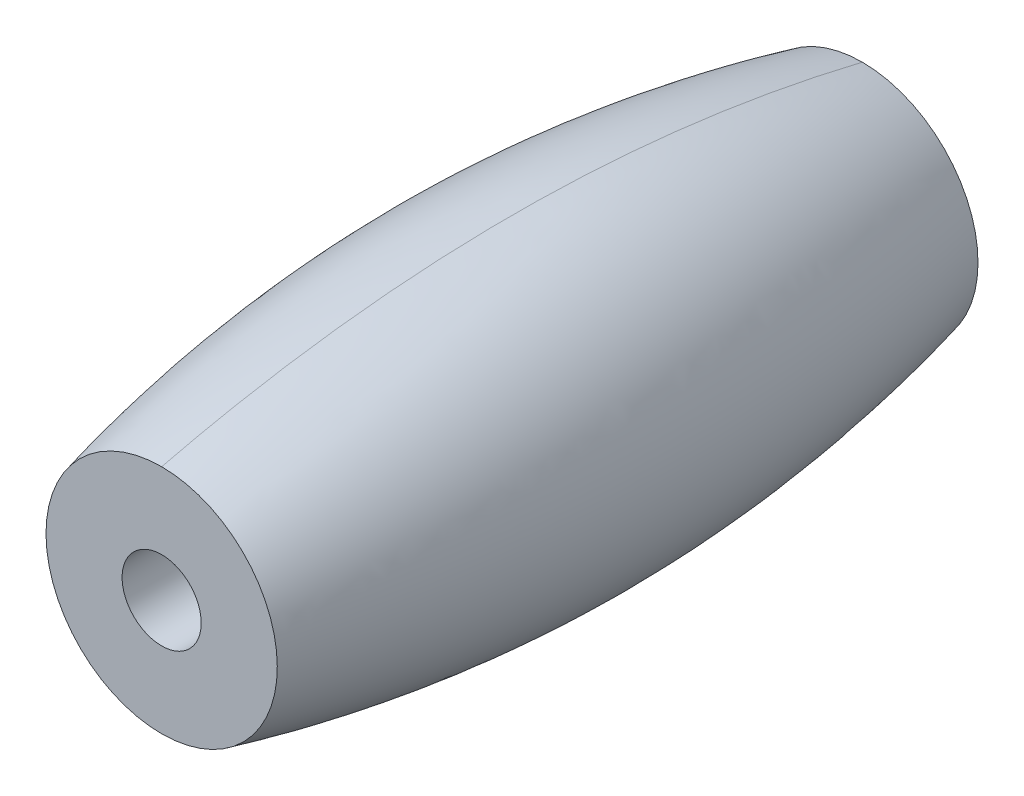
ISO-10303-21;
HEADER;
FILE_DESCRIPTION(('STEP AP214'),'2;1');
FILE_NAME('part.step','',(''),(''),'','','');
FILE_SCHEMA(('AUTOMOTIVE_DESIGN { 1 0 10303 214 1 1 1 1 }'));
ENDSEC;
DATA;
#1=APPLICATION_CONTEXT('core data for automotive mechanical design processes');
#2=APPLICATION_PROTOCOL_DEFINITION('international standard','automotive_design',2000,#1);
#3=PRODUCT_CONTEXT('',#1,'mechanical');
#4=PRODUCT('Part','Part','',(#3));
#5=PRODUCT_RELATED_PRODUCT_CATEGORY('part','',(#4));
#6=PRODUCT_DEFINITION_FORMATION('','',#4);
#7=PRODUCT_DEFINITION_CONTEXT('part definition',#1,'design');
#8=PRODUCT_DEFINITION('design','',#6,#7);
#9=PRODUCT_DEFINITION_SHAPE('','',#8);
#10=(LENGTH_UNIT() NAMED_UNIT(*) SI_UNIT(.MILLI.,.METRE.));
#11=(NAMED_UNIT(*) PLANE_ANGLE_UNIT() SI_UNIT($,.RADIAN.));
#12=(NAMED_UNIT(*) SI_UNIT($,.STERADIAN.) SOLID_ANGLE_UNIT());
#13=UNCERTAINTY_MEASURE_WITH_UNIT(LENGTH_MEASURE(1.E-05),#10,'distance_accuracy_value','');
#14=(GEOMETRIC_REPRESENTATION_CONTEXT(3) GLOBAL_UNCERTAINTY_ASSIGNED_CONTEXT((#13)) GLOBAL_UNIT_ASSIGNED_CONTEXT((#10,
#11,#12)) REPRESENTATION_CONTEXT('',''));
#15=CARTESIAN_POINT('',(0.,0.,0.));
#16=DIRECTION('',(0.,0.,1.));
#17=DIRECTION('',(1.,0.,0.));
#18=AXIS2_PLACEMENT_3D('',#15,#16,#17);
#19=CARTESIAN_POINT('',(0.,0.,-15.5));
#20=DIRECTION('',(0.,0.,1.));
#21=DIRECTION('',(1.,0.,0.));
#22=AXIS2_PLACEMENT_3D('',#19,#20,#21);
#23=CYLINDRICAL_SURFACE('',#22,1.75);
#24=CARTESIAN_POINT('',(0.,0.,15.5));
#25=DIRECTION('',(0.,0.,1.));
#26=DIRECTION('',(1.,0.,0.));
#27=AXIS2_PLACEMENT_3D('',#24,#25,#26);
#28=CIRCLE('',#27,1.75);
#29=CARTESIAN_POINT('',(1.75,0.,15.5));
#30=VERTEX_POINT('',#29);
#31=EDGE_CURVE('E20',#30,#30,#28,.T.);
#32=ORIENTED_EDGE('',*,*,#31,.T.);
#33=EDGE_LOOP('',(#32));
#34=FACE_BOUND('',#33,.T.);
#35=CARTESIAN_POINT('',(0.,0.,-15.5));
#36=DIRECTION('',(0.,0.,1.));
#37=DIRECTION('',(1.,0.,0.));
#38=AXIS2_PLACEMENT_3D('',#35,#36,#37);
#39=CIRCLE('',#38,1.75);
#40=CARTESIAN_POINT('',(1.75,0.,-15.5));
#41=VERTEX_POINT('',#40);
#42=EDGE_CURVE('E53',#41,#41,#39,.T.);
#43=ORIENTED_EDGE('',*,*,#42,.F.);
#44=EDGE_LOOP('',(#43));
#45=FACE_BOUND('',#44,.T.);
#46=ADVANCED_FACE('F17',(#34,#45),#23,.F.);
#47=CARTESIAN_POINT('',(-20.5,0.,15.5));
#48=DIRECTION('',(0.,0.,-1.));
#49=DIRECTION('',(-1.,0.,0.));
#50=AXIS2_PLACEMENT_3D('',#47,#48,#49);
#51=PLANE('',#50);
#52=CARTESIAN_POINT('',(0.,-5.11644,15.5));
#53=CARTESIAN_POINT('',(0.143901488542291,-5.11645547230674,15.5));
#54=CARTESIAN_POINT('',(0.287800752897487,-5.11036973729051,15.5));
#55=CARTESIAN_POINT('',(0.574569782651204,-5.08610760334701,15.5));
#56=CARTESIAN_POINT('',(0.717439597013051,-5.06793178334427,15.5));
#57=CARTESIAN_POINT('',(1.00103894259648,-5.01961819658264,15.5));
#58=CARTESIAN_POINT('',(1.14176990767389,-4.98948884709283,15.5));
#59=CARTESIAN_POINT('',(1.42019317193016,-4.91748739559707,15.5));
#60=CARTESIAN_POINT('',(1.55788550801181,-4.87561543628463,15.5));
#61=CARTESIAN_POINT('',(1.82929384625372,-4.78041113361414,15.5));
#62=CARTESIAN_POINT('',(1.96300869822273,-4.72707551122511,15.5));
#63=CARTESIAN_POINT('',(2.2255189956495,-4.60930863118867,15.5));
#64=CARTESIAN_POINT('',(2.35431260533059,-4.54487328142696,15.5));
#65=CARTESIAN_POINT('',(2.60594072934076,-4.40541833152062,15.5));
#66=CARTESIAN_POINT('',(2.7287785738615,-4.33040474014384,15.5));
#67=CARTESIAN_POINT('',(2.96774449295074,-4.17026923586841,15.5));
#68=CARTESIAN_POINT('',(3.0838700743841,-4.08514360246755,15.5));
#69=CARTESIAN_POINT('',(3.30849753796031,-3.90544269676679,15.5));
#70=CARTESIAN_POINT('',(3.41700205120326,-3.81087071331166,15.5));
#71=CARTESIAN_POINT('',(3.62569927499699,-3.6128878446648,15.5));
#72=CARTESIAN_POINT('',(3.7258889014891,-3.50947370846575,15.5));
#73=CARTESIAN_POINT('',(3.9171783809226,-3.29459533967625,15.5));
#74=CARTESIAN_POINT('',(4.00828019833705,-3.18313285588242,15.5));
#75=CARTESIAN_POINT('',(4.18080311955136,-2.95288763869504,15.5));
#76=CARTESIAN_POINT('',(4.26222063591069,-2.83410221718809,15.5));
#77=CARTESIAN_POINT('',(4.41472517512616,-2.59014376637786,15.5));
#78=CARTESIAN_POINT('',(4.4858164534139,-2.46497339720301,15.5));
#79=CARTESIAN_POINT('',(4.61722762965512,-2.20904216961842,15.5));
#80=CARTESIAN_POINT('',(4.67754354203817,-2.07827926472591,15.5));
#81=CARTESIAN_POINT('',(4.78691903127813,-1.81219388086062,15.5));
#82=CARTESIAN_POINT('',(4.83598346518723,-1.67687339835095,15.5));
#83=CARTESIAN_POINT('',(4.92255669701057,-1.4025302776786,15.5));
#84=CARTESIAN_POINT('',(4.96006123571185,-1.26350629541893,15.5));
#85=CARTESIAN_POINT('',(5.02321281628097,-0.982840138134138,15.5));
#86=CARTESIAN_POINT('',(5.04886385254653,-0.841198861843199,15.5));
#87=CARTESIAN_POINT('',(5.08815163443001,-0.55620949424986,15.5));
#88=CARTESIAN_POINT('',(5.1017841990122,-0.412860826536017,15.5));
#89=CARTESIAN_POINT('',(5.11692173022535,-0.125546293245192,15.5));
#90=CARTESIAN_POINT('',(5.11842852512264,0.0184194760129722,15.5));
#91=CARTESIAN_POINT('',(5.10930861644689,0.305966185444165,15.5));
#92=CARTESIAN_POINT('',(5.09868191280941,0.449547125615149,15.5));
#93=CARTESIAN_POINT('',(5.06536781111796,0.735326835818068,15.5));
#94=CARTESIAN_POINT('',(5.04267843653375,0.877525375447223,15.5));
#95=CARTESIAN_POINT('',(4.98540912049786,1.15945598072385,15.5));
#96=CARTESIAN_POINT('',(4.95083331521847,1.29918888659008,15.5));
#97=CARTESIAN_POINT('',(4.87002080896778,1.57529495723835,15.5));
#98=CARTESIAN_POINT('',(4.82377997612876,1.711666912711,15.5));
#99=CARTESIAN_POINT('',(4.71999150069998,1.97998029351588,15.5));
#100=CARTESIAN_POINT('',(4.66244802414537,2.1119233303826,15.5));
#101=CARTESIAN_POINT('',(4.53642749350421,2.3705449972668,15.5));
#102=CARTESIAN_POINT('',(4.46794613103574,2.49722152794894,15.5));
#103=CARTESIAN_POINT('',(4.32058043806262,2.74430819546597,15.5));
#104=CARTESIAN_POINT('',(4.24169995597081,2.86472062758393,15.5));
#105=CARTESIAN_POINT('',(4.07405023373337,3.09851103644918,15.5));
#106=CARTESIAN_POINT('',(3.98527783856069,3.21188675077887,15.5));
#107=CARTESIAN_POINT('',(3.79853068833572,3.43071499204807,15.5));
#108=CARTESIAN_POINT('',(3.70055934225755,3.53617042823495,15.5));
#109=CARTESIAN_POINT('',(3.49605876934974,3.73847876270254,15.5));
#110=CARTESIAN_POINT('',(3.38952754039922,3.83532963719251,15.5));
#111=CARTESIAN_POINT('',(3.16872546072265,4.0196783621965,15.5));
#112=CARTESIAN_POINT('',(3.0544574799059,4.10717965017586,15.5));
#113=CARTESIAN_POINT('',(2.81887755757515,4.27230533648298,15.5));
#114=CARTESIAN_POINT('',(2.69756082564851,4.34992290062456,15.5));
#115=CARTESIAN_POINT('',(2.44886392867372,4.49463165827499,15.5));
#116=CARTESIAN_POINT('',(2.32148601840058,4.56172672689166,15.5));
#117=CARTESIAN_POINT('',(2.06140335976868,4.68500857880134,15.5));
#118=CARTESIAN_POINT('',(1.92869350424607,4.74118458753916,15.5));
#119=CARTESIAN_POINT('',(1.65905928739907,4.84212710539971,15.5));
#120=CARTESIAN_POINT('',(1.52213652977878,4.88689789731103,15.5));
#121=CARTESIAN_POINT('',(1.24516105219786,4.96469574062652,15.5));
#122=CARTESIAN_POINT('',(1.10511194700933,4.9977356767995,15.5));
#123=CARTESIAN_POINT('',(0.822784628998195,5.05189356496613,15.5));
#124=CARTESIAN_POINT('',(0.680507545739348,5.07301736926325,15.5));
#125=CARTESIAN_POINT('',(0.448267346520383,5.09755748281366,15.5));
#126=CARTESIAN_POINT('',(0.35867598396879,5.10464294009045,15.5));
#127=CARTESIAN_POINT('',(0.179392856494255,5.11408080774032,15.5));
#128=CARTESIAN_POINT('',(0.0897015023981847,5.11644102320992,15.5));
#129=CARTESIAN_POINT('',(0.,5.11644,15.5));
#130=B_SPLINE_CURVE_WITH_KNOTS('',3,(#52,#53,#54,#55,#56,#57,#58,#59,#60,#61,#62,#63,#64,#65,
#66,#67,#68,#69,#70,#71,#72,#73,#74,#75,#76,#77,#78,#79,#80,#81,#82,#83,#84,#85,#86,#87,#88,#89,
#90,#91,#92,#93,#94,#95,#96,#97,#98,#99,#100,#101,#102,#103,#104,#105,#106,#107,#108,#109,#110,
#111,#112,#113,#114,#115,#116,#117,#118,#119,#120,#121,#122,#123,#124,#125,#126,#127,#128,#129),
.UNSPECIFIED.,.F.,.F.,(4,2,2,2,2,2,2,2,2,2,2,2,2,2,2,2,2,2,2,2,2,2,2,2,2,2,2,2,2,2,2,2,2,2,2,2,
2,2,4),(0.,0.431572698912746,0.863124733782766,1.29437342221001,1.72561687042953,
2.15698383474938,2.58851017195668,3.01979236892079,3.45123374099837,3.88252542242256,
4.31397636505441,4.74533383974251,5.17685061157314,5.60818904819623,6.03968669856527,
6.4709977273744,6.90246748215546,7.33379173387725,7.76526597732315,8.1966751638999,
8.6280843527681,9.05956425203189,9.49089415910564,9.92237706253193,10.3537012233549,
10.7851957016438,11.2165309422425,11.6480041532034,12.0793180939377,12.5107332125164,
12.9419891674185,13.3735417171899,13.8049349644825,14.2367517585739,14.6684061607301,
15.0995849710468,15.5305518341386,15.8000506380871,16.069103918719),.UNSPECIFIED.);
#131=CARTESIAN_POINT('',(0.,-5.11644,15.5));
#132=VERTEX_POINT('',#131);
#133=CARTESIAN_POINT('',(0.,5.11644,15.5));
#134=VERTEX_POINT('',#133);
#135=EDGE_CURVE('E49',#132,#134,#130,.T.);
#136=ORIENTED_EDGE('',*,*,#135,.T.);
#137=CARTESIAN_POINT('',(0.,5.11644,15.5));
#138=CARTESIAN_POINT('',(-0.14390148854229,5.11645547230674,15.5));
#139=CARTESIAN_POINT('',(-0.287800752897487,5.1103697372905,15.5));
#140=CARTESIAN_POINT('',(-0.574569782651204,5.08610760334701,15.5));
#141=CARTESIAN_POINT('',(-0.717439597013052,5.06793178334427,15.5));
#142=CARTESIAN_POINT('',(-1.00103894259648,5.01961819658264,15.5));
#143=CARTESIAN_POINT('',(-1.14176990767389,4.98948884709283,15.5));
#144=CARTESIAN_POINT('',(-1.42019317193016,4.91748739559707,15.5));
#145=CARTESIAN_POINT('',(-1.55788550801181,4.87561543628463,15.5));
#146=CARTESIAN_POINT('',(-1.82929384625372,4.78041113361414,15.5));
#147=CARTESIAN_POINT('',(-1.96300869822273,4.72707551122511,15.5));
#148=CARTESIAN_POINT('',(-2.2255189956495,4.60930863118867,15.5));
#149=CARTESIAN_POINT('',(-2.35431260533059,4.54487328142696,15.5));
#150=CARTESIAN_POINT('',(-2.60594072934076,4.40541833152062,15.5));
#151=CARTESIAN_POINT('',(-2.7287785738615,4.33040474014384,15.5));
#152=CARTESIAN_POINT('',(-2.96774449295074,4.17026923586842,15.5));
#153=CARTESIAN_POINT('',(-3.0838700743841,4.08514360246755,15.5));
#154=CARTESIAN_POINT('',(-3.30849753796031,3.90544269676679,15.5));
#155=CARTESIAN_POINT('',(-3.41700205120326,3.81087071331166,15.5));
#156=CARTESIAN_POINT('',(-3.62569927499699,3.6128878446648,15.5));
#157=CARTESIAN_POINT('',(-3.7258889014891,3.50947370846575,15.5));
#158=CARTESIAN_POINT('',(-3.9171783809226,3.29459533967626,15.5));
#159=CARTESIAN_POINT('',(-4.00828019833704,3.18313285588242,15.5));
#160=CARTESIAN_POINT('',(-4.18080311955135,2.95288763869504,15.5));
#161=CARTESIAN_POINT('',(-4.26222063591069,2.83410221718809,15.5));
#162=CARTESIAN_POINT('',(-4.41472517512616,2.59014376637786,15.5));
#163=CARTESIAN_POINT('',(-4.4858164534139,2.46497339720301,15.5));
#164=CARTESIAN_POINT('',(-4.61722762965512,2.20904216961843,15.5));
#165=CARTESIAN_POINT('',(-4.67754354203816,2.07827926472591,15.5));
#166=CARTESIAN_POINT('',(-4.78691903127813,1.81219388086062,15.5));
#167=CARTESIAN_POINT('',(-4.83598346518723,1.67687339835095,15.5));
#168=CARTESIAN_POINT('',(-4.92255669701057,1.4025302776786,15.5));
#169=CARTESIAN_POINT('',(-4.96006123571185,1.26350629541893,15.5));
#170=CARTESIAN_POINT('',(-5.02321281628096,0.982840138134141,15.5));
#171=CARTESIAN_POINT('',(-5.04886385254653,0.841198861843202,15.5));
#172=CARTESIAN_POINT('',(-5.08815163443001,0.556209494249863,15.5));
#173=CARTESIAN_POINT('',(-5.1017841990122,0.412860826536021,15.5));
#174=CARTESIAN_POINT('',(-5.11692173022535,0.125546293245196,15.5));
#175=CARTESIAN_POINT('',(-5.11842852512264,-0.0184194760129679,15.5));
#176=CARTESIAN_POINT('',(-5.10930861644689,-0.30596618544416,15.5));
#177=CARTESIAN_POINT('',(-5.09868191280941,-0.449547125615144,15.5));
#178=CARTESIAN_POINT('',(-5.06536781111796,-0.735326835818063,15.5));
#179=CARTESIAN_POINT('',(-5.04267843653375,-0.877525375447218,15.5));
#180=CARTESIAN_POINT('',(-4.98540912049786,-1.15945598072385,15.5));
#181=CARTESIAN_POINT('',(-4.95083331521847,-1.29918888659008,15.5));
#182=CARTESIAN_POINT('',(-4.87002080896778,-1.57529495723835,15.5));
#183=CARTESIAN_POINT('',(-4.82377997612876,-1.71166691271099,15.5));
#184=CARTESIAN_POINT('',(-4.71999150069998,-1.97998029351588,15.5));
#185=CARTESIAN_POINT('',(-4.66244802414537,-2.11192333038259,15.5));
#186=CARTESIAN_POINT('',(-4.53642749350422,-2.3705449972668,15.5));
#187=CARTESIAN_POINT('',(-4.46794613103574,-2.49722152794894,15.5));
#188=CARTESIAN_POINT('',(-4.32058043806262,-2.74430819546597,15.5));
#189=CARTESIAN_POINT('',(-4.24169995597081,-2.86472062758393,15.5));
#190=CARTESIAN_POINT('',(-4.07405023373337,-3.09851103644918,15.5));
#191=CARTESIAN_POINT('',(-3.98527783856069,-3.21188675077887,15.5));
#192=CARTESIAN_POINT('',(-3.79853068833572,-3.43071499204807,15.5));
#193=CARTESIAN_POINT('',(-3.70055934225755,-3.53617042823495,15.5));
#194=CARTESIAN_POINT('',(-3.49605876934974,-3.73847876270254,15.5));
#195=CARTESIAN_POINT('',(-3.38952754039922,-3.83532963719251,15.5));
#196=CARTESIAN_POINT('',(-3.16872546072265,-4.0196783621965,15.5));
#197=CARTESIAN_POINT('',(-3.0544574799059,-4.10717965017586,15.5));
#198=CARTESIAN_POINT('',(-2.81887755757515,-4.27230533648298,15.5));
#199=CARTESIAN_POINT('',(-2.69756082564851,-4.34992290062456,15.5));
#200=CARTESIAN_POINT('',(-2.44886392867372,-4.49463165827499,15.5));
#201=CARTESIAN_POINT('',(-2.32148601840058,-4.56172672689166,15.5));
#202=CARTESIAN_POINT('',(-2.06140335976868,-4.68500857880134,15.5));
#203=CARTESIAN_POINT('',(-1.92869350424607,-4.74118458753916,15.5));
#204=CARTESIAN_POINT('',(-1.65905928739907,-4.84212710539971,15.5));
#205=CARTESIAN_POINT('',(-1.52213652977878,-4.88689789731103,15.5));
#206=CARTESIAN_POINT('',(-1.24516105219786,-4.96469574062652,15.5));
#207=CARTESIAN_POINT('',(-1.10511194700933,-4.9977356767995,15.5));
#208=CARTESIAN_POINT('',(-0.822784628998197,-5.05189356496613,15.5));
#209=CARTESIAN_POINT('',(-0.680507545739349,-5.07301736926325,15.5));
#210=CARTESIAN_POINT('',(-0.448267346520384,-5.09755748281366,15.5));
#211=CARTESIAN_POINT('',(-0.358675983968791,-5.10464294009045,15.5));
#212=CARTESIAN_POINT('',(-0.179392856494256,-5.11408080774032,15.5));
#213=CARTESIAN_POINT('',(-0.0897015023981856,-5.11644102320992,15.5));
#214=CARTESIAN_POINT('',(0.,-5.11644,15.5));
#215=B_SPLINE_CURVE_WITH_KNOTS('',3,(#137,#138,#139,#140,#141,#142,#143,#144,#145,#146,#147,
#148,#149,#150,#151,#152,#153,#154,#155,#156,#157,#158,#159,#160,#161,#162,#163,#164,#165,#166,
#167,#168,#169,#170,#171,#172,#173,#174,#175,#176,#177,#178,#179,#180,#181,#182,#183,#184,#185,
#186,#187,#188,#189,#190,#191,#192,#193,#194,#195,#196,#197,#198,#199,#200,#201,#202,#203,#204,
#205,#206,#207,#208,#209,#210,#211,#212,#213,#214),.UNSPECIFIED.,.F.,.F.,(4,2,2,2,2,2,2,2,2,2,2,
2,2,2,2,2,2,2,2,2,2,2,2,2,2,2,2,2,2,2,2,2,2,2,2,2,2,2,4),(0.,0.431572698912746,
0.863124733782766,1.29437342221001,1.72561687042953,2.15698383474938,2.58851017195667,
3.01979236892079,3.45123374099837,3.88252542242256,4.31397636505441,4.7453338397425,
5.17685061157313,5.60818904819623,6.03968669856527,6.4709977273744,6.90246748215546,
7.33379173387725,7.76526597732315,8.1966751638999,8.6280843527681,9.05956425203189,
9.49089415910564,9.92237706253192,10.3537012233549,10.7851957016438,11.2165309422425,
11.6480041532034,12.0793180939377,12.5107332125164,12.9419891674185,13.3735417171899,
13.8049349644825,14.2367517585739,14.6684061607301,15.0995849710468,15.5305518341386,
15.8000506380871,16.069103918719),.UNSPECIFIED.);
#216=EDGE_CURVE('E46',#134,#132,#215,.T.);
#217=ORIENTED_EDGE('',*,*,#216,.T.);
#218=EDGE_LOOP('',(#136,#217));
#219=FACE_BOUND('',#218,.T.);
#220=ORIENTED_EDGE('',*,*,#31,.F.);
#221=EDGE_LOOP('',(#220));
#222=FACE_BOUND('',#221,.T.);
#223=ADVANCED_FACE('F47',(#219,#222),#51,.F.);
#224=CARTESIAN_POINT('',(0.,5.11644,-15.5));
#225=CARTESIAN_POINT('',(-10.23288,5.11644,-15.5));
#226=CARTESIAN_POINT('',(-10.23288,-5.11644,-15.5));
#227=CARTESIAN_POINT('',(0.,-5.11644,-15.5));
#228=CARTESIAN_POINT('',(0.,8.88355999999999,0.));
#229=CARTESIAN_POINT('',(-17.76712,8.88356,0.));
#230=CARTESIAN_POINT('',(-17.76712,-8.88355999999999,0.));
#231=CARTESIAN_POINT('',(0.,-8.88355999999999,0.));
#232=CARTESIAN_POINT('',(0.,5.11644,15.5));
#233=CARTESIAN_POINT('',(-10.23288,5.11644,15.5));
#234=CARTESIAN_POINT('',(-10.23288,-5.11643999999999,15.5));
#235=CARTESIAN_POINT('',(0.,-5.11644,15.5));
#236=(BOUNDED_SURFACE() B_SPLINE_SURFACE(2,3,((#224,#225,#226,#227),(#228,#229,#230,#231),(#232,
#233,#234,#235)),.UNSPECIFIED.,.F.,.F.,.F.) B_SPLINE_SURFACE_WITH_KNOTS((3,3),(4,4),(0.19,0.81),
(0.,1.),.UNSPECIFIED.) GEOMETRIC_REPRESENTATION_ITEM() RATIONAL_B_SPLINE_SURFACE(((1.,
0.333333333333333,0.333333333333333,1.),(1.,0.333333333333333,0.333333333333333,1.),(1.,
0.333333333333333,0.333333333333333,1.))) REPRESENTATION_ITEM('') SURFACE());
#237=CARTESIAN_POINT('',(0.,-5.11644,-15.5));
#238=CARTESIAN_POINT('',(-0.143901488542293,-5.11645547230674,-15.5));
#239=CARTESIAN_POINT('',(-0.28780075289749,-5.11036973729051,-15.5));
#240=CARTESIAN_POINT('',(-0.574569782651207,-5.08610760334701,-15.5));
#241=CARTESIAN_POINT('',(-0.717439597013053,-5.06793178334427,-15.5));
#242=CARTESIAN_POINT('',(-1.00103894259648,-5.01961819658264,-15.5));
#243=CARTESIAN_POINT('',(-1.14176990767389,-4.98948884709283,-15.5));
#244=CARTESIAN_POINT('',(-1.42019317193017,-4.91748739559708,-15.5));
#245=CARTESIAN_POINT('',(-1.55788550801181,-4.87561543628463,-15.5));
#246=CARTESIAN_POINT('',(-1.82929384625372,-4.78041113361414,-15.5));
#247=CARTESIAN_POINT('',(-1.96300869822273,-4.72707551122511,-15.5));
#248=CARTESIAN_POINT('',(-2.2255189956495,-4.60930863118867,-15.5));
#249=CARTESIAN_POINT('',(-2.35431260533059,-4.54487328142696,-15.5));
#250=CARTESIAN_POINT('',(-2.60594072934076,-4.40541833152062,-15.5));
#251=CARTESIAN_POINT('',(-2.7287785738615,-4.33040474014384,-15.5));
#252=CARTESIAN_POINT('',(-2.96774449295074,-4.17026923586842,-15.5));
#253=CARTESIAN_POINT('',(-3.0838700743841,-4.08514360246755,-15.5));
#254=CARTESIAN_POINT('',(-3.30849753796031,-3.90544269676679,-15.5));
#255=CARTESIAN_POINT('',(-3.41700205120326,-3.81087071331166,-15.5));
#256=CARTESIAN_POINT('',(-3.62569927499699,-3.6128878446648,-15.5));
#257=CARTESIAN_POINT('',(-3.7258889014891,-3.50947370846575,-15.5));
#258=CARTESIAN_POINT('',(-3.9171783809226,-3.29459533967626,-15.5));
#259=CARTESIAN_POINT('',(-4.00828019833705,-3.18313285588242,-15.5));
#260=CARTESIAN_POINT('',(-4.18080311955135,-2.95288763869504,-15.5));
#261=CARTESIAN_POINT('',(-4.26222063591069,-2.83410221718809,-15.5));
#262=CARTESIAN_POINT('',(-4.41472517512616,-2.59014376637786,-15.5));
#263=CARTESIAN_POINT('',(-4.4858164534139,-2.46497339720301,-15.5));
#264=CARTESIAN_POINT('',(-4.61722762965512,-2.20904216961842,-15.5));
#265=CARTESIAN_POINT('',(-4.67754354203817,-2.07827926472591,-15.5));
#266=CARTESIAN_POINT('',(-4.78691903127813,-1.81219388086062,-15.5));
#267=CARTESIAN_POINT('',(-4.83598346518723,-1.67687339835095,-15.5));
#268=CARTESIAN_POINT('',(-4.92255669701057,-1.40253027767859,-15.5));
#269=CARTESIAN_POINT('',(-4.96006123571185,-1.26350629541893,-15.5));
#270=CARTESIAN_POINT('',(-5.02321281628097,-0.982840138134138,-15.5));
#271=CARTESIAN_POINT('',(-5.04886385254653,-0.841198861843199,-15.5));
#272=CARTESIAN_POINT('',(-5.08815163443001,-0.556209494249859,-15.5));
#273=CARTESIAN_POINT('',(-5.1017841990122,-0.412860826536017,-15.5));
#274=CARTESIAN_POINT('',(-5.11692173022535,-0.125546293245191,-15.5));
#275=CARTESIAN_POINT('',(-5.11842852512264,0.0184194760129733,-15.5));
#276=CARTESIAN_POINT('',(-5.10930861644689,0.305966185444166,-15.5));
#277=CARTESIAN_POINT('',(-5.09868191280941,0.449547125615151,-15.5));
#278=CARTESIAN_POINT('',(-5.06536781111796,0.735326835818069,-15.5));
#279=CARTESIAN_POINT('',(-5.04267843653375,0.877525375447223,-15.5));
#280=CARTESIAN_POINT('',(-4.98540912049786,1.15945598072385,-15.5));
#281=CARTESIAN_POINT('',(-4.95083331521848,1.29918888659008,-15.5));
#282=CARTESIAN_POINT('',(-4.87002080896778,1.57529495723835,-15.5));
#283=CARTESIAN_POINT('',(-4.82377997612876,1.711666912711,-15.5));
#284=CARTESIAN_POINT('',(-4.71999150069998,1.97998029351588,-15.5));
#285=CARTESIAN_POINT('',(-4.66244802414537,2.11192333038259,-15.5));
#286=CARTESIAN_POINT('',(-4.53642749350422,2.3705449972668,-15.5));
#287=CARTESIAN_POINT('',(-4.46794613103574,2.49722152794894,-15.5));
#288=CARTESIAN_POINT('',(-4.32058043806262,2.74430819546597,-15.5));
#289=CARTESIAN_POINT('',(-4.24169995597081,2.86472062758393,-15.5));
#290=CARTESIAN_POINT('',(-4.07405023373337,3.09851103644918,-15.5));
#291=CARTESIAN_POINT('',(-3.98527783856069,3.21188675077887,-15.5));
#292=CARTESIAN_POINT('',(-3.79853068833572,3.43071499204807,-15.5));
#293=CARTESIAN_POINT('',(-3.70055934225755,3.53617042823496,-15.5));
#294=CARTESIAN_POINT('',(-3.49605876934974,3.73847876270255,-15.5));
#295=CARTESIAN_POINT('',(-3.38952754039922,3.83532963719252,-15.5));
#296=CARTESIAN_POINT('',(-3.16872546072265,4.01967836219651,-15.5));
#297=CARTESIAN_POINT('',(-3.0544574799059,4.10717965017586,-15.5));
#298=CARTESIAN_POINT('',(-2.81887755757515,4.27230533648298,-15.5));
#299=CARTESIAN_POINT('',(-2.69756082564851,4.34992290062456,-15.5));
#300=CARTESIAN_POINT('',(-2.44886392867372,4.49463165827499,-15.5));
#301=CARTESIAN_POINT('',(-2.32148601840058,4.56172672689166,-15.5));
#302=CARTESIAN_POINT('',(-2.06140335976868,4.68500857880134,-15.5));
#303=CARTESIAN_POINT('',(-1.92869350424607,4.74118458753916,-15.5));
#304=CARTESIAN_POINT('',(-1.65905928739907,4.8421271053997,-15.5));
#305=CARTESIAN_POINT('',(-1.52213652977878,4.88689789731103,-15.5));
#306=CARTESIAN_POINT('',(-1.24516105219786,4.96469574062652,-15.5));
#307=CARTESIAN_POINT('',(-1.10511194700933,4.9977356767995,-15.5));
#308=CARTESIAN_POINT('',(-0.822784628998195,5.05189356496613,-15.5));
#309=CARTESIAN_POINT('',(-0.680507545739348,5.07301736926325,-15.5));
#310=CARTESIAN_POINT('',(-0.448267346520383,5.09755748281366,-15.5));
#311=CARTESIAN_POINT('',(-0.358675983968789,5.10464294009045,-15.5));
#312=CARTESIAN_POINT('',(-0.179392856494254,5.11408080774032,-15.5));
#313=CARTESIAN_POINT('',(-0.089701502398183,5.11644102320992,-15.5));
#314=CARTESIAN_POINT('',(0.,5.11644,-15.5));
#315=B_SPLINE_CURVE_WITH_KNOTS('',3,(#237,#238,#239,#240,#241,#242,#243,#244,#245,#246,#247,
#248,#249,#250,#251,#252,#253,#254,#255,#256,#257,#258,#259,#260,#261,#262,#263,#264,#265,#266,
#267,#268,#269,#270,#271,#272,#273,#274,#275,#276,#277,#278,#279,#280,#281,#282,#283,#284,#285,
#286,#287,#288,#289,#290,#291,#292,#293,#294,#295,#296,#297,#298,#299,#300,#301,#302,#303,#304,
#305,#306,#307,#308,#309,#310,#311,#312,#313,#314),.UNSPECIFIED.,.F.,.F.,(4,2,2,2,2,2,2,2,2,2,2,
2,2,2,2,2,2,2,2,2,2,2,2,2,2,2,2,2,2,2,2,2,2,2,2,2,2,2,4),(0.,0.431572698912746,
0.863124733782766,1.29437342221001,1.72561687042953,2.15698383474938,2.58851017195667,
3.01979236892079,3.45123374099837,3.88252542242256,4.31397636505441,4.74533383974251,
5.17685061157314,5.60818904819623,6.03968669856527,6.47099772737441,6.90246748215546,
7.33379173387725,7.76526597732315,8.1966751638999,8.6280843527681,9.05956425203189,
9.49089415910564,9.92237706253192,10.3537012233549,10.7851957016438,11.2165309422425,
11.6480041532034,12.0793180939377,12.5107332125164,12.9419891674185,13.3735417171899,
13.8049349644825,14.2367517585739,14.6684061607301,15.0995849710468,15.5305518341386,
15.8000506380871,16.069103918719),.UNSPECIFIED.);
#316=CARTESIAN_POINT('',(0.,-5.11644,-15.5));
#317=VERTEX_POINT('',#316);
#318=CARTESIAN_POINT('',(0.,5.11644,-15.5));
#319=VERTEX_POINT('',#318);
#320=EDGE_CURVE('E33',#317,#319,#315,.T.);
#321=CARTESIAN_POINT('',(0.,-5.11644,-15.5));
#322=CARTESIAN_POINT('',(0.,-8.88355999999999,0.));
#323=CARTESIAN_POINT('',(0.,-5.11644,15.5));
#324=B_SPLINE_CURVE_WITH_KNOTS('',2,(#321,#322,#323),.UNSPECIFIED.,.F.,.F.,(3,3),(0.19,0.81),.UNSPECIFIED.);
#325=EDGE_CURVE('E42',#317,#132,#324,.T.);
#326=CARTESIAN_POINT('',(0.,5.11644,-15.5));
#327=CARTESIAN_POINT('',(0.,8.88355999999999,0.));
#328=CARTESIAN_POINT('',(0.,5.11644,15.5));
#329=B_SPLINE_CURVE_WITH_KNOTS('',2,(#326,#327,#328),.UNSPECIFIED.,.F.,.F.,(3,3),(0.19,0.81),.UNSPECIFIED.);
#330=EDGE_CURVE('E26',#134,#319,#329,.F.);
#331=ORIENTED_EDGE('',*,*,#320,.F.);
#332=ORIENTED_EDGE('',*,*,#325,.T.);
#333=ORIENTED_EDGE('',*,*,#216,.F.);
#334=ORIENTED_EDGE('',*,*,#330,.T.);
#335=EDGE_LOOP('',(#331,#332,#333,#334));
#336=FACE_BOUND('',#335,.T.);
#337=ADVANCED_FACE('F56',(#336),#236,.F.);
#338=CARTESIAN_POINT('',(-20.5,0.,-15.5));
#339=DIRECTION('',(0.,0.,-1.));
#340=DIRECTION('',(-1.,0.,0.));
#341=AXIS2_PLACEMENT_3D('',#338,#339,#340);
#342=PLANE('',#341);
#343=ORIENTED_EDGE('',*,*,#320,.T.);
#344=CARTESIAN_POINT('',(0.,5.11644,-15.5));
#345=CARTESIAN_POINT('',(0.143901488542292,5.11645547230674,-15.5));
#346=CARTESIAN_POINT('',(0.287800752897489,5.1103697372905,-15.5));
#347=CARTESIAN_POINT('',(0.574569782651206,5.08610760334701,-15.5));
#348=CARTESIAN_POINT('',(0.717439597013053,5.06793178334427,-15.5));
#349=CARTESIAN_POINT('',(1.00103894259648,5.01961819658264,-15.5));
#350=CARTESIAN_POINT('',(1.14176990767389,4.98948884709283,-15.5));
#351=CARTESIAN_POINT('',(1.42019317193017,4.91748739559707,-15.5));
#352=CARTESIAN_POINT('',(1.55788550801181,4.87561543628463,-15.5));
#353=CARTESIAN_POINT('',(1.82929384625372,4.78041113361414,-15.5));
#354=CARTESIAN_POINT('',(1.96300869822273,4.72707551122511,-15.5));
#355=CARTESIAN_POINT('',(2.2255189956495,4.60930863118867,-15.5));
#356=CARTESIAN_POINT('',(2.35431260533059,4.54487328142696,-15.5));
#357=CARTESIAN_POINT('',(2.60594072934076,4.40541833152062,-15.5));
#358=CARTESIAN_POINT('',(2.7287785738615,4.33040474014384,-15.5));
#359=CARTESIAN_POINT('',(2.96774449295074,4.17026923586841,-15.5));
#360=CARTESIAN_POINT('',(3.0838700743841,4.08514360246755,-15.5));
#361=CARTESIAN_POINT('',(3.30849753796031,3.90544269676679,-15.5));
#362=CARTESIAN_POINT('',(3.41700205120326,3.81087071331166,-15.5));
#363=CARTESIAN_POINT('',(3.62569927499699,3.6128878446648,-15.5));
#364=CARTESIAN_POINT('',(3.7258889014891,3.50947370846575,-15.5));
#365=CARTESIAN_POINT('',(3.9171783809226,3.29459533967626,-15.5));
#366=CARTESIAN_POINT('',(4.00828019833704,3.18313285588242,-15.5));
#367=CARTESIAN_POINT('',(4.18080311955135,2.95288763869504,-15.5));
#368=CARTESIAN_POINT('',(4.26222063591069,2.83410221718809,-15.5));
#369=CARTESIAN_POINT('',(4.41472517512616,2.59014376637787,-15.5));
#370=CARTESIAN_POINT('',(4.4858164534139,2.46497339720301,-15.5));
#371=CARTESIAN_POINT('',(4.61722762965512,2.20904216961843,-15.5));
#372=CARTESIAN_POINT('',(4.67754354203817,2.07827926472591,-15.5));
#373=CARTESIAN_POINT('',(4.78691903127813,1.81219388086062,-15.5));
#374=CARTESIAN_POINT('',(4.83598346518722,1.67687339835095,-15.5));
#375=CARTESIAN_POINT('',(4.92255669701056,1.4025302776786,-15.5));
#376=CARTESIAN_POINT('',(4.96006123571185,1.26350629541893,-15.5));
#377=CARTESIAN_POINT('',(5.02321281628097,0.982840138134139,-15.5));
#378=CARTESIAN_POINT('',(5.04886385254653,0.841198861843199,-15.5));
#379=CARTESIAN_POINT('',(5.08815163443001,0.55620949424986,-15.5));
#380=CARTESIAN_POINT('',(5.1017841990122,0.412860826536017,-15.5));
#381=CARTESIAN_POINT('',(5.11692173022536,0.125546293245192,-15.5));
#382=CARTESIAN_POINT('',(5.11842852512264,-0.0184194760129721,-15.5));
#383=CARTESIAN_POINT('',(5.10930861644689,-0.305966185444165,-15.5));
#384=CARTESIAN_POINT('',(5.09868191280941,-0.449547125615149,-15.5));
#385=CARTESIAN_POINT('',(5.06536781111796,-0.735326835818068,-15.5));
#386=CARTESIAN_POINT('',(5.04267843653375,-0.877525375447222,-15.5));
#387=CARTESIAN_POINT('',(4.98540912049786,-1.15945598072385,-15.5));
#388=CARTESIAN_POINT('',(4.95083331521847,-1.29918888659008,-15.5));
#389=CARTESIAN_POINT('',(4.87002080896778,-1.57529495723835,-15.5));
#390=CARTESIAN_POINT('',(4.82377997612876,-1.711666912711,-15.5));
#391=CARTESIAN_POINT('',(4.71999150069998,-1.97998029351588,-15.5));
#392=CARTESIAN_POINT('',(4.66244802414537,-2.1119233303826,-15.5));
#393=CARTESIAN_POINT('',(4.53642749350421,-2.3705449972668,-15.5));
#394=CARTESIAN_POINT('',(4.46794613103574,-2.49722152794894,-15.5));
#395=CARTESIAN_POINT('',(4.32058043806262,-2.74430819546597,-15.5));
#396=CARTESIAN_POINT('',(4.24169995597081,-2.86472062758393,-15.5));
#397=CARTESIAN_POINT('',(4.07405023373337,-3.09851103644918,-15.5));
#398=CARTESIAN_POINT('',(3.98527783856069,-3.21188675077887,-15.5));
#399=CARTESIAN_POINT('',(3.79853068833572,-3.43071499204807,-15.5));
#400=CARTESIAN_POINT('',(3.70055934225755,-3.53617042823495,-15.5));
#401=CARTESIAN_POINT('',(3.49605876934974,-3.73847876270254,-15.5));
#402=CARTESIAN_POINT('',(3.38952754039922,-3.83532963719251,-15.5));
#403=CARTESIAN_POINT('',(3.16872546072265,-4.0196783621965,-15.5));
#404=CARTESIAN_POINT('',(3.0544574799059,-4.10717965017586,-15.5));
#405=CARTESIAN_POINT('',(2.81887755757515,-4.27230533648298,-15.5));
#406=CARTESIAN_POINT('',(2.69756082564851,-4.34992290062456,-15.5));
#407=CARTESIAN_POINT('',(2.44886392867372,-4.49463165827499,-15.5));
#408=CARTESIAN_POINT('',(2.32148601840058,-4.56172672689166,-15.5));
#409=CARTESIAN_POINT('',(2.06140335976868,-4.68500857880134,-15.5));
#410=CARTESIAN_POINT('',(1.92869350424607,-4.74118458753916,-15.5));
#411=CARTESIAN_POINT('',(1.65905928739907,-4.8421271053997,-15.5));
#412=CARTESIAN_POINT('',(1.52213652977878,-4.88689789731103,-15.5));
#413=CARTESIAN_POINT('',(1.24516105219786,-4.96469574062652,-15.5));
#414=CARTESIAN_POINT('',(1.10511194700933,-4.99773567679951,-15.5));
#415=CARTESIAN_POINT('',(0.822784628998197,-5.05189356496613,-15.5));
#416=CARTESIAN_POINT('',(0.680507545739349,-5.07301736926325,-15.5));
#417=CARTESIAN_POINT('',(0.448267346520384,-5.09755748281366,-15.5));
#418=CARTESIAN_POINT('',(0.35867598396879,-5.10464294009045,-15.5));
#419=CARTESIAN_POINT('',(0.179392856494255,-5.11408080774032,-15.5));
#420=CARTESIAN_POINT('',(0.0897015023981837,-5.11644102320992,-15.5));
#421=CARTESIAN_POINT('',(0.,-5.11644,-15.5));
#422=B_SPLINE_CURVE_WITH_KNOTS('',3,(#344,#345,#346,#347,#348,#349,#350,#351,#352,#353,#354,
#355,#356,#357,#358,#359,#360,#361,#362,#363,#364,#365,#366,#367,#368,#369,#370,#371,#372,#373,
#374,#375,#376,#377,#378,#379,#380,#381,#382,#383,#384,#385,#386,#387,#388,#389,#390,#391,#392,
#393,#394,#395,#396,#397,#398,#399,#400,#401,#402,#403,#404,#405,#406,#407,#408,#409,#410,#411,
#412,#413,#414,#415,#416,#417,#418,#419,#420,#421),.UNSPECIFIED.,.F.,.F.,(4,2,2,2,2,2,2,2,2,2,2,
2,2,2,2,2,2,2,2,2,2,2,2,2,2,2,2,2,2,2,2,2,2,2,2,2,2,2,4),(0.,0.431572698912745,
0.863124733782765,1.29437342221001,1.72561687042953,2.15698383474938,2.58851017195667,
3.01979236892079,3.45123374099837,3.88252542242256,4.31397636505441,4.7453338397425,
5.17685061157313,5.60818904819623,6.03968669856526,6.4709977273744,6.90246748215546,
7.33379173387725,7.76526597732315,8.1966751638999,8.6280843527681,9.05956425203189,
9.49089415910564,9.92237706253192,10.3537012233549,10.7851957016438,11.2165309422425,
11.6480041532034,12.0793180939377,12.5107332125164,12.9419891674185,13.3735417171899,
13.8049349644825,14.2367517585739,14.6684061607301,15.0995849710468,15.5305518341386,
15.8000506380871,16.069103918719),.UNSPECIFIED.);
#423=EDGE_CURVE('E11',#319,#317,#422,.T.);
#424=ORIENTED_EDGE('',*,*,#423,.T.);
#425=EDGE_LOOP('',(#343,#424));
#426=FACE_BOUND('',#425,.T.);
#427=ORIENTED_EDGE('',*,*,#42,.T.);
#428=EDGE_LOOP('',(#427));
#429=FACE_BOUND('',#428,.T.);
#430=ADVANCED_FACE('F80',(#426,#429),#342,.T.);
#431=CARTESIAN_POINT('',(0.,-5.11644,-15.5));
#432=CARTESIAN_POINT('',(10.23288,-5.11644,-15.5));
#433=CARTESIAN_POINT('',(10.23288,5.11644,-15.5));
#434=CARTESIAN_POINT('',(0.,5.11644,-15.5));
#435=CARTESIAN_POINT('',(0.,-8.88355999999999,0.));
#436=CARTESIAN_POINT('',(17.76712,-8.88355999999999,0.));
#437=CARTESIAN_POINT('',(17.76712,8.88355999999999,0.));
#438=CARTESIAN_POINT('',(0.,8.88355999999999,0.));
#439=CARTESIAN_POINT('',(0.,-5.11644,15.5));
#440=CARTESIAN_POINT('',(10.23288,-5.11644,15.5));
#441=CARTESIAN_POINT('',(10.23288,5.11644,15.5));
#442=CARTESIAN_POINT('',(0.,5.11644,15.5));
#443=(BOUNDED_SURFACE() B_SPLINE_SURFACE(2,3,((#431,#432,#433,#434),(#435,#436,#437,#438),(#439,
#440,#441,#442)),.UNSPECIFIED.,.F.,.F.,.F.) B_SPLINE_SURFACE_WITH_KNOTS((3,3),(4,4),(0.19,0.81),
(0.,1.),.UNSPECIFIED.) GEOMETRIC_REPRESENTATION_ITEM() RATIONAL_B_SPLINE_SURFACE(((1.,
0.333333333333333,0.333333333333333,1.),(1.,0.333333333333333,0.333333333333333,1.),(1.,
0.333333333333333,0.333333333333333,1.))) REPRESENTATION_ITEM('') SURFACE());
#444=ORIENTED_EDGE('',*,*,#330,.F.);
#445=ORIENTED_EDGE('',*,*,#135,.F.);
#446=ORIENTED_EDGE('',*,*,#325,.F.);
#447=ORIENTED_EDGE('',*,*,#423,.F.);
#448=EDGE_LOOP('',(#444,#445,#446,#447));
#449=FACE_BOUND('',#448,.T.);
#450=ADVANCED_FACE('F54',(#449),#443,.F.);
#451=CLOSED_SHELL('',(#46,#223,#337,#430,#450));
#452=MANIFOLD_SOLID_BREP('B1',#451);
#453=ADVANCED_BREP_SHAPE_REPRESENTATION('',(#18,#452),#14);
#454=SHAPE_DEFINITION_REPRESENTATION(#9,#453);
ENDSEC;
END-ISO-10303-21;
